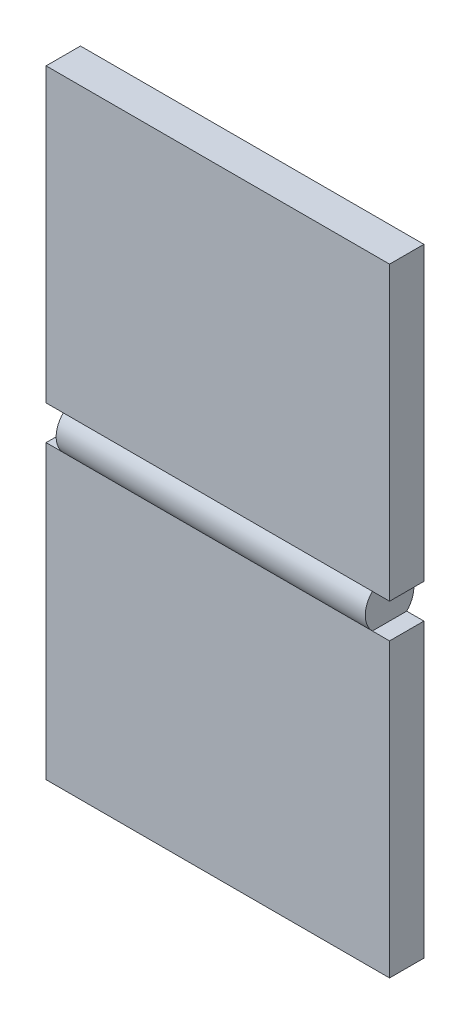
ISO-10303-21;
HEADER;
FILE_DESCRIPTION(('STEP AP214'),'2;1');
FILE_NAME('part.step','',(''),(''),'','','');
FILE_SCHEMA(('AUTOMOTIVE_DESIGN { 1 0 10303 214 1 1 1 1 }'));
ENDSEC;
DATA;
#1=APPLICATION_CONTEXT('core data for automotive mechanical design processes');
#2=APPLICATION_PROTOCOL_DEFINITION('international standard','automotive_design',2000,#1);
#3=PRODUCT_CONTEXT('',#1,'mechanical');
#4=PRODUCT('Part','Part','',(#3));
#5=PRODUCT_RELATED_PRODUCT_CATEGORY('part','',(#4));
#6=PRODUCT_DEFINITION_FORMATION('','',#4);
#7=PRODUCT_DEFINITION_CONTEXT('part definition',#1,'design');
#8=PRODUCT_DEFINITION('design','',#6,#7);
#9=PRODUCT_DEFINITION_SHAPE('','',#8);
#10=(LENGTH_UNIT() NAMED_UNIT(*) SI_UNIT(.MILLI.,.METRE.));
#11=(NAMED_UNIT(*) PLANE_ANGLE_UNIT() SI_UNIT($,.RADIAN.));
#12=(NAMED_UNIT(*) SI_UNIT($,.STERADIAN.) SOLID_ANGLE_UNIT());
#13=UNCERTAINTY_MEASURE_WITH_UNIT(LENGTH_MEASURE(1.E-05),#10,'distance_accuracy_value','');
#14=(GEOMETRIC_REPRESENTATION_CONTEXT(3) GLOBAL_UNCERTAINTY_ASSIGNED_CONTEXT((#13)) GLOBAL_UNIT_ASSIGNED_CONTEXT((#10,
#11,#12)) REPRESENTATION_CONTEXT('',''));
#15=CARTESIAN_POINT('',(0.,0.,0.));
#16=DIRECTION('',(0.,0.,1.));
#17=DIRECTION('',(1.,0.,0.));
#18=AXIS2_PLACEMENT_3D('',#15,#16,#17);
#19=CARTESIAN_POINT('',(-9.,0.,1.));
#20=DIRECTION('',(1.,0.,0.));
#21=DIRECTION('',(0.,0.,-1.));
#22=AXIS2_PLACEMENT_3D('',#19,#20,#21);
#23=PLANE('',#22);
#24=DIRECTION('',(0.,0.,1.));
#25=VECTOR('',#24,1.);
#26=CARTESIAN_POINT('',(-9.,0.999999999999996,1.));
#27=LINE('',#26,#25);
#28=CARTESIAN_POINT('',(-9.,0.999999999999996,0.));
#29=VERTEX_POINT('',#28);
#30=CARTESIAN_POINT('',(-9.,0.999999999999996,2.));
#31=VERTEX_POINT('',#30);
#32=EDGE_CURVE('E171',#29,#31,#27,.T.);
#33=ORIENTED_EDGE('',*,*,#32,.F.);
#34=CARTESIAN_POINT('',(-9.,0.,1.));
#35=DIRECTION('',(1.,0.,0.));
#36=DIRECTION('',(0.,0.,-1.));
#37=AXIS2_PLACEMENT_3D('',#34,#35,#36);
#38=CIRCLE('',#37,1.41421356237309);
#39=CARTESIAN_POINT('',(-9.,-0.999999999999997,0.));
#40=VERTEX_POINT('',#39);
#41=EDGE_CURVE('E195',#40,#29,#38,.T.);
#42=ORIENTED_EDGE('',*,*,#41,.F.);
#43=DIRECTION('',(0.,0.,1.));
#44=VECTOR('',#43,1.);
#45=CARTESIAN_POINT('',(-9.,-1.,2.));
#46=LINE('',#45,#44);
#47=CARTESIAN_POINT('',(-9.,-1.,2.));
#48=VERTEX_POINT('',#47);
#49=EDGE_CURVE('E203',#40,#48,#46,.T.);
#50=ORIENTED_EDGE('',*,*,#49,.T.);
#51=EDGE_CURVE('E71',#31,#48,#38,.T.);
#52=ORIENTED_EDGE('',*,*,#51,.F.);
#53=EDGE_LOOP('',(#33,#42,#50,#52));
#54=FACE_BOUND('',#53,.T.);
#55=ADVANCED_FACE('F47',(#54),#23,.F.);
#56=CARTESIAN_POINT('',(9.,0.,1.));
#57=DIRECTION('',(1.,0.,0.));
#58=DIRECTION('',(0.,0.,-1.));
#59=AXIS2_PLACEMENT_3D('',#56,#57,#58);
#60=PLANE('',#59);
#61=CARTESIAN_POINT('',(9.,0.,1.));
#62=DIRECTION('',(1.,0.,0.));
#63=DIRECTION('',(0.,0.,-1.));
#64=AXIS2_PLACEMENT_3D('',#61,#62,#63);
#65=CIRCLE('',#64,1.41421356237309);
#66=CARTESIAN_POINT('',(9.,-0.999999999999998,0.));
#67=VERTEX_POINT('',#66);
#68=CARTESIAN_POINT('',(9.,0.999999999999997,0.));
#69=VERTEX_POINT('',#68);
#70=EDGE_CURVE('E191',#67,#69,#65,.T.);
#71=ORIENTED_EDGE('',*,*,#70,.T.);
#72=DIRECTION('',(0.,0.,1.));
#73=VECTOR('',#72,1.);
#74=CARTESIAN_POINT('',(9.,0.999999999999996,1.));
#75=LINE('',#74,#73);
#76=CARTESIAN_POINT('',(8.99999999999999,0.999999999999996,2.));
#77=VERTEX_POINT('',#76);
#78=EDGE_CURVE('E166',#69,#77,#75,.T.);
#79=ORIENTED_EDGE('',*,*,#78,.T.);
#80=CARTESIAN_POINT('',(9.,-0.999999999999998,2.));
#81=VERTEX_POINT('',#80);
#82=EDGE_CURVE('E190',#77,#81,#65,.T.);
#83=ORIENTED_EDGE('',*,*,#82,.T.);
#84=DIRECTION('',(0.,0.,1.));
#85=VECTOR('',#84,1.);
#86=CARTESIAN_POINT('',(9.,-0.999999999999998,2.));
#87=LINE('',#86,#85);
#88=EDGE_CURVE('E199',#67,#81,#87,.T.);
#89=ORIENTED_EDGE('',*,*,#88,.F.);
#90=EDGE_LOOP('',(#71,#79,#83,#89));
#91=FACE_BOUND('',#90,.T.);
#92=ADVANCED_FACE('F264',(#91),#60,.T.);
#93=CARTESIAN_POINT('',(-9.,0.,1.));
#94=DIRECTION('',(1.,0.,0.));
#95=DIRECTION('',(0.,0.,-1.));
#96=AXIS2_PLACEMENT_3D('',#93,#94,#95);
#97=CYLINDRICAL_SURFACE('',#96,1.41421356237309);
#98=ORIENTED_EDGE('',*,*,#41,.T.);
#99=DIRECTION('',(1.,0.,0.));
#100=VECTOR('',#99,1.);
#101=CARTESIAN_POINT('',(-9.,0.999999999999997,0.));
#102=LINE('',#101,#100);
#103=EDGE_CURVE('E56',#29,#69,#102,.T.);
#104=ORIENTED_EDGE('',*,*,#103,.T.);
#105=ORIENTED_EDGE('',*,*,#70,.F.);
#106=DIRECTION('',(-1.,0.,0.));
#107=VECTOR('',#106,1.);
#108=CARTESIAN_POINT('',(-10.,-1.,0.));
#109=LINE('',#108,#107);
#110=EDGE_CURVE('E239',#67,#40,#109,.T.);
#111=ORIENTED_EDGE('',*,*,#110,.T.);
#112=EDGE_LOOP('',(#98,#104,#105,#111));
#113=FACE_BOUND('',#112,.T.);
#114=ADVANCED_FACE('F259',(#113),#97,.T.);
#115=CARTESIAN_POINT('',(-10.,-1.,2.));
#116=DIRECTION('',(0.,-1.,0.));
#117=DIRECTION('',(1.,0.,0.));
#118=AXIS2_PLACEMENT_3D('',#115,#116,#117);
#119=PLANE('',#118);
#120=ORIENTED_EDGE('',*,*,#49,.F.);
#121=CARTESIAN_POINT('',(-10.,-1.,0.));
#122=VERTEX_POINT('',#121);
#123=EDGE_CURVE('E234',#40,#122,#109,.T.);
#124=ORIENTED_EDGE('',*,*,#123,.T.);
#125=DIRECTION('',(0.,0.,-1.));
#126=VECTOR('',#125,1.);
#127=CARTESIAN_POINT('',(-10.,-1.,2.));
#128=LINE('',#127,#126);
#129=CARTESIAN_POINT('',(-10.,-1.,2.));
#130=VERTEX_POINT('',#129);
#131=EDGE_CURVE('E245',#130,#122,#128,.T.);
#132=ORIENTED_EDGE('',*,*,#131,.F.);
#133=DIRECTION('',(-1.,0.,0.));
#134=VECTOR('',#133,1.);
#135=CARTESIAN_POINT('',(-10.,-1.,2.));
#136=LINE('',#135,#134);
#137=EDGE_CURVE('E219',#48,#130,#136,.T.);
#138=ORIENTED_EDGE('',*,*,#137,.F.);
#139=EDGE_LOOP('',(#120,#124,#132,#138));
#140=FACE_BOUND('',#139,.T.);
#141=ADVANCED_FACE('F285',(#140),#119,.F.);
#142=CARTESIAN_POINT('',(-10.,-18.,2.));
#143=DIRECTION('',(0.,1.,0.));
#144=DIRECTION('',(0.,0.,1.));
#145=AXIS2_PLACEMENT_3D('',#142,#143,#144);
#146=PLANE('',#145);
#147=DIRECTION('',(1.,0.,0.));
#148=VECTOR('',#147,1.);
#149=CARTESIAN_POINT('',(-10.,-18.,0.));
#150=LINE('',#149,#148);
#151=CARTESIAN_POINT('',(-10.,-18.,0.));
#152=VERTEX_POINT('',#151);
#153=CARTESIAN_POINT('',(10.,-18.,0.));
#154=VERTEX_POINT('',#153);
#155=EDGE_CURVE('E210',#152,#154,#150,.T.);
#156=ORIENTED_EDGE('',*,*,#155,.T.);
#157=DIRECTION('',(0.,0.,-1.));
#158=VECTOR('',#157,1.);
#159=CARTESIAN_POINT('',(10.,-18.,2.));
#160=LINE('',#159,#158);
#161=CARTESIAN_POINT('',(10.,-18.,2.));
#162=VERTEX_POINT('',#161);
#163=EDGE_CURVE('E253',#162,#154,#160,.T.);
#164=ORIENTED_EDGE('',*,*,#163,.F.);
#165=DIRECTION('',(1.,0.,0.));
#166=VECTOR('',#165,1.);
#167=CARTESIAN_POINT('',(-10.,-18.,2.));
#168=LINE('',#167,#166);
#169=CARTESIAN_POINT('',(-10.,-18.,2.));
#170=VERTEX_POINT('',#169);
#171=EDGE_CURVE('E211',#170,#162,#168,.T.);
#172=ORIENTED_EDGE('',*,*,#171,.F.);
#173=DIRECTION('',(0.,0.,-1.));
#174=VECTOR('',#173,1.);
#175=CARTESIAN_POINT('',(-10.,-18.,2.));
#176=LINE('',#175,#174);
#177=EDGE_CURVE('E227',#170,#152,#176,.T.);
#178=ORIENTED_EDGE('',*,*,#177,.T.);
#179=EDGE_LOOP('',(#156,#164,#172,#178));
#180=FACE_BOUND('',#179,.T.);
#181=ADVANCED_FACE('F49',(#180),#146,.F.);
#182=CARTESIAN_POINT('',(10.,-18.,2.));
#183=DIRECTION('',(-1.,0.,0.));
#184=DIRECTION('',(0.,0.,1.));
#185=AXIS2_PLACEMENT_3D('',#182,#183,#184);
#186=PLANE('',#185);
#187=DIRECTION('',(0.,1.,0.));
#188=VECTOR('',#187,1.);
#189=CARTESIAN_POINT('',(10.,-18.,0.));
#190=LINE('',#189,#188);
#191=CARTESIAN_POINT('',(10.,-0.999999999999998,0.));
#192=VERTEX_POINT('',#191);
#193=EDGE_CURVE('E231',#154,#192,#190,.T.);
#194=ORIENTED_EDGE('',*,*,#193,.T.);
#195=DIRECTION('',(0.,0.,-1.));
#196=VECTOR('',#195,1.);
#197=CARTESIAN_POINT('',(10.,-0.999999999999998,2.));
#198=LINE('',#197,#196);
#199=CARTESIAN_POINT('',(10.,-0.999999999999998,2.));
#200=VERTEX_POINT('',#199);
#201=EDGE_CURVE('E249',#200,#192,#198,.T.);
#202=ORIENTED_EDGE('',*,*,#201,.F.);
#203=DIRECTION('',(0.,1.,0.));
#204=VECTOR('',#203,1.);
#205=CARTESIAN_POINT('',(10.,-18.,2.));
#206=LINE('',#205,#204);
#207=EDGE_CURVE('E215',#162,#200,#206,.T.);
#208=ORIENTED_EDGE('',*,*,#207,.F.);
#209=ORIENTED_EDGE('',*,*,#163,.T.);
#210=EDGE_LOOP('',(#194,#202,#208,#209));
#211=FACE_BOUND('',#210,.T.);
#212=ADVANCED_FACE('F294',(#211),#186,.F.);
#213=EDGE_CURVE('E235',#192,#67,#109,.T.);
#214=ORIENTED_EDGE('',*,*,#213,.T.);
#215=ORIENTED_EDGE('',*,*,#88,.T.);
#216=EDGE_CURVE('E220',#200,#81,#136,.T.);
#217=ORIENTED_EDGE('',*,*,#216,.F.);
#218=ORIENTED_EDGE('',*,*,#201,.T.);
#219=EDGE_LOOP('',(#214,#215,#217,#218));
#220=FACE_BOUND('',#219,.T.);
#221=ADVANCED_FACE('F268',(#220),#119,.F.);
#222=CARTESIAN_POINT('',(-10.,-18.,2.));
#223=DIRECTION('',(1.,0.,0.));
#224=DIRECTION('',(0.,0.,-1.));
#225=AXIS2_PLACEMENT_3D('',#222,#223,#224);
#226=PLANE('',#225);
#227=DIRECTION('',(0.,-1.,0.));
#228=VECTOR('',#227,1.);
#229=CARTESIAN_POINT('',(-10.,-18.,0.));
#230=LINE('',#229,#228);
#231=EDGE_CURVE('E216',#122,#152,#230,.T.);
#232=ORIENTED_EDGE('',*,*,#231,.T.);
#233=ORIENTED_EDGE('',*,*,#177,.F.);
#234=DIRECTION('',(0.,-1.,0.));
#235=VECTOR('',#234,1.);
#236=CARTESIAN_POINT('',(-10.,-18.,2.));
#237=LINE('',#236,#235);
#238=EDGE_CURVE('E224',#130,#170,#237,.T.);
#239=ORIENTED_EDGE('',*,*,#238,.F.);
#240=ORIENTED_EDGE('',*,*,#131,.T.);
#241=EDGE_LOOP('',(#232,#233,#239,#240));
#242=FACE_BOUND('',#241,.T.);
#243=ADVANCED_FACE('F288',(#242),#226,.F.);
#244=CARTESIAN_POINT('',(0.,0.,2.));
#245=DIRECTION('',(0.,0.,1.));
#246=DIRECTION('',(1.,0.,0.));
#247=AXIS2_PLACEMENT_3D('',#244,#245,#246);
#248=PLANE('',#247);
#249=ORIENTED_EDGE('',*,*,#171,.T.);
#250=ORIENTED_EDGE('',*,*,#207,.T.);
#251=ORIENTED_EDGE('',*,*,#216,.T.);
#252=DIRECTION('',(1.,0.,0.));
#253=VECTOR('',#252,1.);
#254=CARTESIAN_POINT('',(-9.,-0.999999999999997,2.));
#255=LINE('',#254,#253);
#256=EDGE_CURVE('E207',#48,#81,#255,.T.);
#257=ORIENTED_EDGE('',*,*,#256,.F.);
#258=ORIENTED_EDGE('',*,*,#137,.T.);
#259=ORIENTED_EDGE('',*,*,#238,.T.);
#260=EDGE_LOOP('',(#249,#250,#251,#257,#258,#259));
#261=FACE_BOUND('',#260,.T.);
#262=ADVANCED_FACE('F272',(#261),#248,.T.);
#263=CARTESIAN_POINT('',(0.,0.,0.));
#264=DIRECTION('',(0.,0.,1.));
#265=DIRECTION('',(1.,0.,0.));
#266=AXIS2_PLACEMENT_3D('',#263,#264,#265);
#267=PLANE('',#266);
#268=ORIENTED_EDGE('',*,*,#155,.F.);
#269=ORIENTED_EDGE('',*,*,#231,.F.);
#270=ORIENTED_EDGE('',*,*,#123,.F.);
#271=ORIENTED_EDGE('',*,*,#110,.F.);
#272=ORIENTED_EDGE('',*,*,#213,.F.);
#273=ORIENTED_EDGE('',*,*,#193,.F.);
#274=EDGE_LOOP('',(#268,#269,#270,#271,#272,#273));
#275=FACE_BOUND('',#274,.T.);
#276=ADVANCED_FACE('F296',(#275),#267,.F.);
#277=DIRECTION('',(1.,0.,0.));
#278=VECTOR('',#277,1.);
#279=CARTESIAN_POINT('',(-9.,0.999999999999997,2.));
#280=LINE('',#279,#278);
#281=EDGE_CURVE('E11',#31,#77,#280,.T.);
#282=ORIENTED_EDGE('',*,*,#281,.F.);
#283=ORIENTED_EDGE('',*,*,#51,.T.);
#284=ORIENTED_EDGE('',*,*,#256,.T.);
#285=ORIENTED_EDGE('',*,*,#82,.F.);
#286=EDGE_LOOP('',(#282,#283,#284,#285));
#287=FACE_BOUND('',#286,.T.);
#288=ADVANCED_FACE('F274',(#287),#97,.T.);
#289=CARTESIAN_POINT('',(-10.,0.999999999999996,2.));
#290=DIRECTION('',(0.,1.,0.));
#291=DIRECTION('',(0.,0.,1.));
#292=AXIS2_PLACEMENT_3D('',#289,#290,#291);
#293=PLANE('',#292);
#294=DIRECTION('',(1.,0.,0.));
#295=VECTOR('',#294,1.);
#296=CARTESIAN_POINT('',(-10.,0.999999999999996,0.));
#297=LINE('',#296,#295);
#298=CARTESIAN_POINT('',(-10.,0.999999999999996,0.));
#299=VERTEX_POINT('',#298);
#300=EDGE_CURVE('E157',#299,#29,#297,.T.);
#301=ORIENTED_EDGE('',*,*,#300,.T.);
#302=ORIENTED_EDGE('',*,*,#32,.T.);
#303=DIRECTION('',(1.,0.,0.));
#304=VECTOR('',#303,1.);
#305=CARTESIAN_POINT('',(-10.,0.999999999999996,2.));
#306=LINE('',#305,#304);
#307=CARTESIAN_POINT('',(-10.,0.999999999999996,2.));
#308=VERTEX_POINT('',#307);
#309=EDGE_CURVE('E152',#308,#31,#306,.T.);
#310=ORIENTED_EDGE('',*,*,#309,.F.);
#311=DIRECTION('',(0.,0.,-1.));
#312=VECTOR('',#311,1.);
#313=CARTESIAN_POINT('',(-10.,0.999999999999996,2.));
#314=LINE('',#313,#312);
#315=EDGE_CURVE('E144',#308,#299,#314,.T.);
#316=ORIENTED_EDGE('',*,*,#315,.T.);
#317=EDGE_LOOP('',(#301,#302,#310,#316));
#318=FACE_BOUND('',#317,.T.);
#319=ADVANCED_FACE('F156',(#318),#293,.F.);
#320=ORIENTED_EDGE('',*,*,#78,.F.);
#321=CARTESIAN_POINT('',(10.,0.999999999999996,0.));
#322=VERTEX_POINT('',#321);
#323=EDGE_CURVE('E63',#69,#322,#297,.T.);
#324=ORIENTED_EDGE('',*,*,#323,.T.);
#325=DIRECTION('',(0.,0.,-1.));
#326=VECTOR('',#325,1.);
#327=CARTESIAN_POINT('',(10.,0.999999999999996,2.));
#328=LINE('',#327,#326);
#329=CARTESIAN_POINT('',(10.,0.999999999999996,2.));
#330=VERTEX_POINT('',#329);
#331=EDGE_CURVE('E310',#330,#322,#328,.T.);
#332=ORIENTED_EDGE('',*,*,#331,.F.);
#333=EDGE_CURVE('E185',#77,#330,#306,.T.);
#334=ORIENTED_EDGE('',*,*,#333,.F.);
#335=EDGE_LOOP('',(#320,#324,#332,#334));
#336=FACE_BOUND('',#335,.T.);
#337=ADVANCED_FACE('F321',(#336),#293,.F.);
#338=CARTESIAN_POINT('',(10.,0.999999999999996,2.));
#339=DIRECTION('',(-1.,0.,0.));
#340=DIRECTION('',(0.,-1.,0.));
#341=AXIS2_PLACEMENT_3D('',#338,#339,#340);
#342=PLANE('',#341);
#343=DIRECTION('',(0.,1.,0.));
#344=VECTOR('',#343,1.);
#345=CARTESIAN_POINT('',(10.,0.999999999999996,0.));
#346=LINE('',#345,#344);
#347=CARTESIAN_POINT('',(10.,18.,0.));
#348=VERTEX_POINT('',#347);
#349=EDGE_CURVE('E173',#322,#348,#346,.T.);
#350=ORIENTED_EDGE('',*,*,#349,.T.);
#351=DIRECTION('',(0.,0.,-1.));
#352=VECTOR('',#351,1.);
#353=CARTESIAN_POINT('',(10.,18.,2.));
#354=LINE('',#353,#352);
#355=CARTESIAN_POINT('',(10.,18.,2.));
#356=VERTEX_POINT('',#355);
#357=EDGE_CURVE('E307',#356,#348,#354,.T.);
#358=ORIENTED_EDGE('',*,*,#357,.F.);
#359=DIRECTION('',(0.,1.,0.));
#360=VECTOR('',#359,1.);
#361=CARTESIAN_POINT('',(10.,0.999999999999996,2.));
#362=LINE('',#361,#360);
#363=EDGE_CURVE('E182',#330,#356,#362,.T.);
#364=ORIENTED_EDGE('',*,*,#363,.F.);
#365=ORIENTED_EDGE('',*,*,#331,.T.);
#366=EDGE_LOOP('',(#350,#358,#364,#365));
#367=FACE_BOUND('',#366,.T.);
#368=ADVANCED_FACE('F317',(#367),#342,.F.);
#369=CARTESIAN_POINT('',(-10.,18.,2.));
#370=DIRECTION('',(0.,-1.,0.));
#371=DIRECTION('',(0.,0.,-1.));
#372=AXIS2_PLACEMENT_3D('',#369,#370,#371);
#373=PLANE('',#372);
#374=DIRECTION('',(-1.,0.,0.));
#375=VECTOR('',#374,1.);
#376=CARTESIAN_POINT('',(-10.,18.,0.));
#377=LINE('',#376,#375);
#378=CARTESIAN_POINT('',(-10.,18.,0.));
#379=VERTEX_POINT('',#378);
#380=EDGE_CURVE('E151',#348,#379,#377,.T.);
#381=ORIENTED_EDGE('',*,*,#380,.T.);
#382=DIRECTION('',(0.,0.,-1.));
#383=VECTOR('',#382,1.);
#384=CARTESIAN_POINT('',(-10.,18.,2.));
#385=LINE('',#384,#383);
#386=CARTESIAN_POINT('',(-10.,18.,2.));
#387=VERTEX_POINT('',#386);
#388=EDGE_CURVE('E147',#387,#379,#385,.T.);
#389=ORIENTED_EDGE('',*,*,#388,.F.);
#390=DIRECTION('',(-1.,0.,0.));
#391=VECTOR('',#390,1.);
#392=CARTESIAN_POINT('',(-10.,18.,2.));
#393=LINE('',#392,#391);
#394=EDGE_CURVE('E179',#356,#387,#393,.T.);
#395=ORIENTED_EDGE('',*,*,#394,.F.);
#396=ORIENTED_EDGE('',*,*,#357,.T.);
#397=EDGE_LOOP('',(#381,#389,#395,#396));
#398=FACE_BOUND('',#397,.T.);
#399=ADVANCED_FACE('F305',(#398),#373,.F.);
#400=CARTESIAN_POINT('',(-10.,0.999999999999996,2.));
#401=DIRECTION('',(1.,0.,0.));
#402=DIRECTION('',(0.,1.,0.));
#403=AXIS2_PLACEMENT_3D('',#400,#401,#402);
#404=PLANE('',#403);
#405=DIRECTION('',(0.,-1.,0.));
#406=VECTOR('',#405,1.);
#407=CARTESIAN_POINT('',(-10.,0.999999999999996,0.));
#408=LINE('',#407,#406);
#409=EDGE_CURVE('E140',#379,#299,#408,.T.);
#410=ORIENTED_EDGE('',*,*,#409,.T.);
#411=ORIENTED_EDGE('',*,*,#315,.F.);
#412=DIRECTION('',(0.,-1.,0.));
#413=VECTOR('',#412,1.);
#414=CARTESIAN_POINT('',(-10.,0.999999999999996,2.));
#415=LINE('',#414,#413);
#416=EDGE_CURVE('E161',#387,#308,#415,.T.);
#417=ORIENTED_EDGE('',*,*,#416,.F.);
#418=ORIENTED_EDGE('',*,*,#388,.T.);
#419=EDGE_LOOP('',(#410,#411,#417,#418));
#420=FACE_BOUND('',#419,.T.);
#421=ADVANCED_FACE('F142',(#420),#404,.F.);
#422=CARTESIAN_POINT('',(0.,0.,2.));
#423=DIRECTION('',(0.,0.,1.));
#424=DIRECTION('',(1.,0.,0.));
#425=AXIS2_PLACEMENT_3D('',#422,#423,#424);
#426=PLANE('',#425);
#427=ORIENTED_EDGE('',*,*,#309,.T.);
#428=ORIENTED_EDGE('',*,*,#281,.T.);
#429=ORIENTED_EDGE('',*,*,#333,.T.);
#430=ORIENTED_EDGE('',*,*,#363,.T.);
#431=ORIENTED_EDGE('',*,*,#394,.T.);
#432=ORIENTED_EDGE('',*,*,#416,.T.);
#433=EDGE_LOOP('',(#427,#428,#429,#430,#431,#432));
#434=FACE_BOUND('',#433,.T.);
#435=ADVANCED_FACE('F299',(#434),#426,.T.);
#436=CARTESIAN_POINT('',(0.,0.,0.));
#437=DIRECTION('',(0.,0.,1.));
#438=DIRECTION('',(1.,0.,0.));
#439=AXIS2_PLACEMENT_3D('',#436,#437,#438);
#440=PLANE('',#439);
#441=ORIENTED_EDGE('',*,*,#300,.F.);
#442=ORIENTED_EDGE('',*,*,#409,.F.);
#443=ORIENTED_EDGE('',*,*,#380,.F.);
#444=ORIENTED_EDGE('',*,*,#349,.F.);
#445=ORIENTED_EDGE('',*,*,#323,.F.);
#446=ORIENTED_EDGE('',*,*,#103,.F.);
#447=EDGE_LOOP('',(#441,#442,#443,#444,#445,#446));
#448=FACE_BOUND('',#447,.T.);
#449=ADVANCED_FACE('F163',(#448),#440,.F.);
#450=CLOSED_SHELL('',(#55,#92,#114,#141,#181,#212,#221,#243,#262,#276,#288,#319,#337,#368,#399,
#421,#435,#449));
#451=MANIFOLD_SOLID_BREP('B2',#450);
#452=ADVANCED_BREP_SHAPE_REPRESENTATION('',(#18,#451),#14);
#453=SHAPE_DEFINITION_REPRESENTATION(#9,#452);
ENDSEC;
END-ISO-10303-21;
